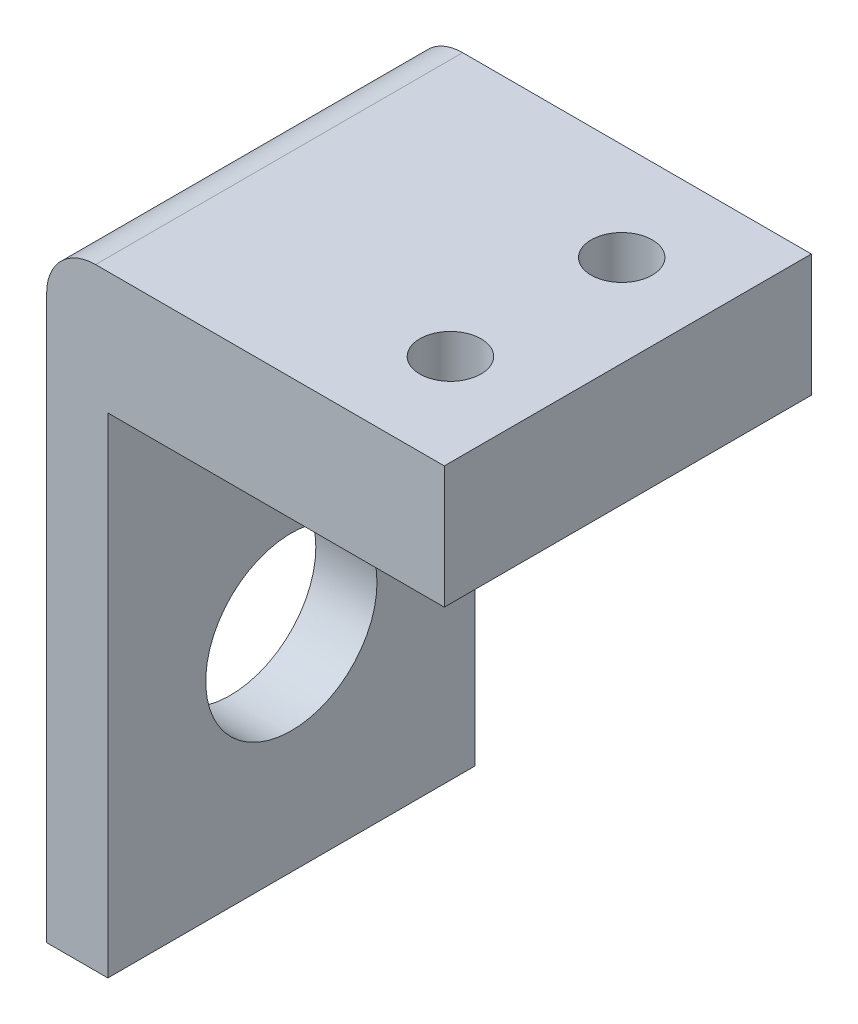
ISO-10303-21;
HEADER;
FILE_DESCRIPTION(('STEP AP214'),'2;1');
FILE_NAME('part.step','',(''),(''),'','','');
FILE_SCHEMA(('AUTOMOTIVE_DESIGN { 1 0 10303 214 1 1 1 1 }'));
ENDSEC;
DATA;
#1=APPLICATION_CONTEXT('core data for automotive mechanical design processes');
#2=APPLICATION_PROTOCOL_DEFINITION('international standard','automotive_design',2000,#1);
#3=PRODUCT_CONTEXT('',#1,'mechanical');
#4=PRODUCT('Part','Part','',(#3));
#5=PRODUCT_RELATED_PRODUCT_CATEGORY('part','',(#4));
#6=PRODUCT_DEFINITION_FORMATION('','',#4);
#7=PRODUCT_DEFINITION_CONTEXT('part definition',#1,'design');
#8=PRODUCT_DEFINITION('design','',#6,#7);
#9=PRODUCT_DEFINITION_SHAPE('','',#8);
#10=(LENGTH_UNIT() NAMED_UNIT(*) SI_UNIT(.MILLI.,.METRE.));
#11=(NAMED_UNIT(*) PLANE_ANGLE_UNIT() SI_UNIT($,.RADIAN.));
#12=(NAMED_UNIT(*) SI_UNIT($,.STERADIAN.) SOLID_ANGLE_UNIT());
#13=UNCERTAINTY_MEASURE_WITH_UNIT(LENGTH_MEASURE(1.E-05),#10,'distance_accuracy_value','');
#14=(GEOMETRIC_REPRESENTATION_CONTEXT(3) GLOBAL_UNCERTAINTY_ASSIGNED_CONTEXT((#13)) GLOBAL_UNIT_ASSIGNED_CONTEXT((#10,
#11,#12)) REPRESENTATION_CONTEXT('',''));
#15=CARTESIAN_POINT('',(0.,0.,0.));
#16=DIRECTION('',(0.,0.,1.));
#17=DIRECTION('',(1.,0.,0.));
#18=AXIS2_PLACEMENT_3D('',#15,#16,#17);
#19=CARTESIAN_POINT('',(2.5,0.,-15.));
#20=DIRECTION('',(0.,0.,1.));
#21=DIRECTION('',(1.,0.,0.));
#22=AXIS2_PLACEMENT_3D('',#19,#20,#21);
#23=PLANE('',#22);
#24=DIRECTION('',(0.,1.,0.));
#25=VECTOR('',#24,1.);
#26=CARTESIAN_POINT('',(-2.5,0.,-15.));
#27=LINE('',#26,#25);
#28=CARTESIAN_POINT('',(-2.5,-17.,-15.));
#29=VERTEX_POINT('',#28);
#30=CARTESIAN_POINT('',(-2.5,29.,-15.));
#31=VERTEX_POINT('',#30);
#32=EDGE_CURVE('E166',#29,#31,#27,.T.);
#33=ORIENTED_EDGE('',*,*,#32,.T.);
#34=CARTESIAN_POINT('',(1.5,29.,-15.));
#35=DIRECTION('',(0.,0.,1.));
#36=DIRECTION('',(1.,0.,0.));
#37=AXIS2_PLACEMENT_3D('',#34,#35,#36);
#38=CIRCLE('',#37,4.);
#39=CARTESIAN_POINT('',(1.5,33.,-15.));
#40=VERTEX_POINT('',#39);
#41=EDGE_CURVE('E11',#31,#40,#38,.F.);
#42=ORIENTED_EDGE('',*,*,#41,.T.);
#43=DIRECTION('',(1.,0.,0.));
#44=VECTOR('',#43,1.);
#45=CARTESIAN_POINT('',(-2.5,33.,-15.));
#46=LINE('',#45,#44);
#47=CARTESIAN_POINT('',(30.,33.,-15.));
#48=VERTEX_POINT('',#47);
#49=EDGE_CURVE('E109',#40,#48,#46,.T.);
#50=ORIENTED_EDGE('',*,*,#49,.T.);
#51=DIRECTION('',(0.,1.,0.));
#52=VECTOR('',#51,1.);
#53=CARTESIAN_POINT('',(30.,0.,-15.));
#54=LINE('',#53,#52);
#55=CARTESIAN_POINT('',(30.,23.,-15.));
#56=VERTEX_POINT('',#55);
#57=EDGE_CURVE('E113',#56,#48,#54,.T.);
#58=ORIENTED_EDGE('',*,*,#57,.F.);
#59=DIRECTION('',(1.,0.,0.));
#60=VECTOR('',#59,1.);
#61=CARTESIAN_POINT('',(-2.5,23.,-15.));
#62=LINE('',#61,#60);
#63=CARTESIAN_POINT('',(2.5,23.,-15.));
#64=VERTEX_POINT('',#63);
#65=EDGE_CURVE('E98',#64,#56,#62,.T.);
#66=ORIENTED_EDGE('',*,*,#65,.F.);
#67=DIRECTION('',(0.,1.,0.));
#68=VECTOR('',#67,1.);
#69=CARTESIAN_POINT('',(2.5,0.,-15.));
#70=LINE('',#69,#68);
#71=CARTESIAN_POINT('',(2.5,-17.,-15.));
#72=VERTEX_POINT('',#71);
#73=EDGE_CURVE('E150',#72,#64,#70,.T.);
#74=ORIENTED_EDGE('',*,*,#73,.F.);
#75=DIRECTION('',(-1.,0.,0.));
#76=VECTOR('',#75,1.);
#77=CARTESIAN_POINT('',(2.5,-17.,-15.));
#78=LINE('',#77,#76);
#79=EDGE_CURVE('E162',#72,#29,#78,.T.);
#80=ORIENTED_EDGE('',*,*,#79,.T.);
#81=EDGE_LOOP('',(#33,#42,#50,#58,#66,#74,#80));
#82=FACE_BOUND('',#81,.T.);
#83=ADVANCED_FACE('F39',(#82),#23,.F.);
#84=CARTESIAN_POINT('',(2.5,0.,15.));
#85=DIRECTION('',(0.,0.,-1.));
#86=DIRECTION('',(0.,1.,0.));
#87=AXIS2_PLACEMENT_3D('',#84,#85,#86);
#88=PLANE('',#87);
#89=DIRECTION('',(1.,0.,0.));
#90=VECTOR('',#89,1.);
#91=CARTESIAN_POINT('',(-2.5,33.,15.));
#92=LINE('',#91,#90);
#93=CARTESIAN_POINT('',(1.5,33.,15.));
#94=VERTEX_POINT('',#93);
#95=CARTESIAN_POINT('',(30.,33.,15.));
#96=VERTEX_POINT('',#95);
#97=EDGE_CURVE('E141',#94,#96,#92,.T.);
#98=ORIENTED_EDGE('',*,*,#97,.F.);
#99=CARTESIAN_POINT('',(1.5,29.,15.));
#100=DIRECTION('',(0.,0.,-1.));
#101=DIRECTION('',(0.,1.,0.));
#102=AXIS2_PLACEMENT_3D('',#99,#100,#101);
#103=CIRCLE('',#102,4.);
#104=CARTESIAN_POINT('',(-2.5,29.,15.));
#105=VERTEX_POINT('',#104);
#106=EDGE_CURVE('E62',#94,#105,#103,.F.);
#107=ORIENTED_EDGE('',*,*,#106,.T.);
#108=DIRECTION('',(0.,-1.,0.));
#109=VECTOR('',#108,1.);
#110=CARTESIAN_POINT('',(-2.5,0.,15.));
#111=LINE('',#110,#109);
#112=CARTESIAN_POINT('',(-2.5,-17.,15.));
#113=VERTEX_POINT('',#112);
#114=EDGE_CURVE('E169',#105,#113,#111,.T.);
#115=ORIENTED_EDGE('',*,*,#114,.T.);
#116=DIRECTION('',(-1.,0.,0.));
#117=VECTOR('',#116,1.);
#118=CARTESIAN_POINT('',(2.5,-17.,15.));
#119=LINE('',#118,#117);
#120=CARTESIAN_POINT('',(2.5,-17.,15.));
#121=VERTEX_POINT('',#120);
#122=EDGE_CURVE('E177',#121,#113,#119,.T.);
#123=ORIENTED_EDGE('',*,*,#122,.F.);
#124=DIRECTION('',(0.,-1.,0.));
#125=VECTOR('',#124,1.);
#126=CARTESIAN_POINT('',(2.5,0.,15.));
#127=LINE('',#126,#125);
#128=CARTESIAN_POINT('',(2.5,23.,15.));
#129=VERTEX_POINT('',#128);
#130=EDGE_CURVE('E156',#129,#121,#127,.T.);
#131=ORIENTED_EDGE('',*,*,#130,.F.);
#132=DIRECTION('',(1.,0.,0.));
#133=VECTOR('',#132,1.);
#134=CARTESIAN_POINT('',(-2.5,23.,15.));
#135=LINE('',#134,#133);
#136=CARTESIAN_POINT('',(30.,23.,15.));
#137=VERTEX_POINT('',#136);
#138=EDGE_CURVE('E137',#129,#137,#135,.T.);
#139=ORIENTED_EDGE('',*,*,#138,.T.);
#140=DIRECTION('',(0.,-1.,0.));
#141=VECTOR('',#140,1.);
#142=CARTESIAN_POINT('',(30.,0.,15.));
#143=LINE('',#142,#141);
#144=EDGE_CURVE('E110',#96,#137,#143,.T.);
#145=ORIENTED_EDGE('',*,*,#144,.F.);
#146=EDGE_LOOP('',(#98,#107,#115,#123,#131,#139,#145));
#147=FACE_BOUND('',#146,.T.);
#148=ADVANCED_FACE('F192',(#147),#88,.F.);
#149=CARTESIAN_POINT('',(2.5,0.,0.));
#150=DIRECTION('',(-1.,0.,0.));
#151=DIRECTION('',(0.,0.,1.));
#152=AXIS2_PLACEMENT_3D('',#149,#150,#151);
#153=CYLINDRICAL_SURFACE('',#152,7.);
#154=CARTESIAN_POINT('',(2.5,0.,0.));
#155=DIRECTION('',(1.,0.,0.));
#156=DIRECTION('',(0.,0.,-1.));
#157=AXIS2_PLACEMENT_3D('',#154,#155,#156);
#158=CIRCLE('',#157,7.);
#159=CARTESIAN_POINT('',(2.5,0.,-7.));
#160=VERTEX_POINT('',#159);
#161=EDGE_CURVE('E146',#160,#160,#158,.T.);
#162=ORIENTED_EDGE('',*,*,#161,.T.);
#163=EDGE_LOOP('',(#162));
#164=FACE_BOUND('',#163,.T.);
#165=CARTESIAN_POINT('',(-2.5,0.,0.));
#166=DIRECTION('',(1.,0.,0.));
#167=DIRECTION('',(0.,0.,-1.));
#168=AXIS2_PLACEMENT_3D('',#165,#166,#167);
#169=CIRCLE('',#168,7.);
#170=CARTESIAN_POINT('',(-2.5,0.,-7.));
#171=VERTEX_POINT('',#170);
#172=EDGE_CURVE('E140',#171,#171,#169,.T.);
#173=ORIENTED_EDGE('',*,*,#172,.F.);
#174=EDGE_LOOP('',(#173));
#175=FACE_BOUND('',#174,.T.);
#176=ADVANCED_FACE('F204',(#164,#175),#153,.F.);
#177=CARTESIAN_POINT('',(2.5,-17.,0.));
#178=DIRECTION('',(0.,1.,0.));
#179=DIRECTION('',(0.,0.,1.));
#180=AXIS2_PLACEMENT_3D('',#177,#178,#179);
#181=PLANE('',#180);
#182=DIRECTION('',(0.,0.,-1.));
#183=VECTOR('',#182,1.);
#184=CARTESIAN_POINT('',(-2.5,-17.,0.));
#185=LINE('',#184,#183);
#186=EDGE_CURVE('E151',#113,#29,#185,.T.);
#187=ORIENTED_EDGE('',*,*,#186,.T.);
#188=ORIENTED_EDGE('',*,*,#79,.F.);
#189=DIRECTION('',(0.,0.,-1.));
#190=VECTOR('',#189,1.);
#191=CARTESIAN_POINT('',(2.5,-17.,0.));
#192=LINE('',#191,#190);
#193=EDGE_CURVE('E159',#121,#72,#192,.T.);
#194=ORIENTED_EDGE('',*,*,#193,.F.);
#195=ORIENTED_EDGE('',*,*,#122,.T.);
#196=EDGE_LOOP('',(#187,#188,#194,#195));
#197=FACE_BOUND('',#196,.T.);
#198=ADVANCED_FACE('F202',(#197),#181,.F.);
#199=CARTESIAN_POINT('',(2.5,0.,0.));
#200=DIRECTION('',(1.,0.,0.));
#201=DIRECTION('',(0.,0.,-1.));
#202=AXIS2_PLACEMENT_3D('',#199,#200,#201);
#203=PLANE('',#202);
#204=ORIENTED_EDGE('',*,*,#161,.F.);
#205=EDGE_LOOP('',(#204));
#206=FACE_BOUND('',#205,.T.);
#207=ORIENTED_EDGE('',*,*,#73,.T.);
#208=DIRECTION('',(0.,0.,1.));
#209=VECTOR('',#208,1.);
#210=CARTESIAN_POINT('',(2.5,23.,0.));
#211=LINE('',#210,#209);
#212=EDGE_CURVE('E104',#64,#129,#211,.T.);
#213=ORIENTED_EDGE('',*,*,#212,.T.);
#214=ORIENTED_EDGE('',*,*,#130,.T.);
#215=ORIENTED_EDGE('',*,*,#193,.T.);
#216=EDGE_LOOP('',(#207,#213,#214,#215));
#217=FACE_BOUND('',#216,.T.);
#218=ADVANCED_FACE('F196',(#206,#217),#203,.T.);
#219=CARTESIAN_POINT('',(-2.5,0.,0.));
#220=DIRECTION('',(1.,0.,0.));
#221=DIRECTION('',(0.,0.,-1.));
#222=AXIS2_PLACEMENT_3D('',#219,#220,#221);
#223=PLANE('',#222);
#224=ORIENTED_EDGE('',*,*,#172,.T.);
#225=EDGE_LOOP('',(#224));
#226=FACE_BOUND('',#225,.T.);
#227=ORIENTED_EDGE('',*,*,#114,.F.);
#228=DIRECTION('',(0.,0.,1.));
#229=VECTOR('',#228,1.);
#230=CARTESIAN_POINT('',(-2.5,29.,-15.));
#231=LINE('',#230,#229);
#232=EDGE_CURVE('E48',#105,#31,#231,.F.);
#233=ORIENTED_EDGE('',*,*,#232,.T.);
#234=ORIENTED_EDGE('',*,*,#32,.F.);
#235=ORIENTED_EDGE('',*,*,#186,.F.);
#236=EDGE_LOOP('',(#227,#233,#234,#235));
#237=FACE_BOUND('',#236,.T.);
#238=ADVANCED_FACE('F201',(#226,#237),#223,.F.);
#239=CARTESIAN_POINT('',(-2.5,23.,0.));
#240=DIRECTION('',(0.,1.,0.));
#241=DIRECTION('',(0.,0.,1.));
#242=AXIS2_PLACEMENT_3D('',#239,#240,#241);
#243=PLANE('',#242);
#244=CARTESIAN_POINT('',(22.5,23.,7.));
#245=DIRECTION('',(0.,1.,0.));
#246=DIRECTION('',(0.,0.,1.));
#247=AXIS2_PLACEMENT_3D('',#244,#245,#246);
#248=CIRCLE('',#247,2.5);
#249=CARTESIAN_POINT('',(22.5,23.,9.5));
#250=VERTEX_POINT('',#249);
#251=EDGE_CURVE('E125',#250,#250,#248,.T.);
#252=ORIENTED_EDGE('',*,*,#251,.T.);
#253=EDGE_LOOP('',(#252));
#254=FACE_BOUND('',#253,.T.);
#255=CARTESIAN_POINT('',(22.5,23.,-7.));
#256=DIRECTION('',(0.,1.,0.));
#257=DIRECTION('',(0.,0.,1.));
#258=AXIS2_PLACEMENT_3D('',#255,#256,#257);
#259=CIRCLE('',#258,2.5);
#260=CARTESIAN_POINT('',(22.5,23.,-4.5));
#261=VERTEX_POINT('',#260);
#262=EDGE_CURVE('E129',#261,#261,#259,.T.);
#263=ORIENTED_EDGE('',*,*,#262,.T.);
#264=EDGE_LOOP('',(#263));
#265=FACE_BOUND('',#264,.T.);
#266=ORIENTED_EDGE('',*,*,#212,.F.);
#267=ORIENTED_EDGE('',*,*,#65,.T.);
#268=DIRECTION('',(0.,0.,1.));
#269=VECTOR('',#268,1.);
#270=CARTESIAN_POINT('',(30.,23.,0.));
#271=LINE('',#270,#269);
#272=EDGE_CURVE('E102',#56,#137,#271,.T.);
#273=ORIENTED_EDGE('',*,*,#272,.T.);
#274=ORIENTED_EDGE('',*,*,#138,.F.);
#275=EDGE_LOOP('',(#266,#267,#273,#274));
#276=FACE_BOUND('',#275,.T.);
#277=ADVANCED_FACE('F100',(#254,#265,#276),#243,.F.);
#278=CARTESIAN_POINT('',(-2.5,33.,0.));
#279=DIRECTION('',(0.,1.,0.));
#280=DIRECTION('',(0.,0.,1.));
#281=AXIS2_PLACEMENT_3D('',#278,#279,#280);
#282=PLANE('',#281);
#283=CARTESIAN_POINT('',(22.5,33.,7.));
#284=DIRECTION('',(0.,1.,0.));
#285=DIRECTION('',(0.,0.,1.));
#286=AXIS2_PLACEMENT_3D('',#283,#284,#285);
#287=CIRCLE('',#286,2.5);
#288=CARTESIAN_POINT('',(22.5,33.,9.5));
#289=VERTEX_POINT('',#288);
#290=EDGE_CURVE('E334',#289,#289,#287,.T.);
#291=ORIENTED_EDGE('',*,*,#290,.F.);
#292=EDGE_LOOP('',(#291));
#293=FACE_BOUND('',#292,.T.);
#294=CARTESIAN_POINT('',(22.5,33.,-7.));
#295=DIRECTION('',(0.,1.,0.));
#296=DIRECTION('',(0.,0.,1.));
#297=AXIS2_PLACEMENT_3D('',#294,#295,#296);
#298=CIRCLE('',#297,2.5);
#299=CARTESIAN_POINT('',(22.5,33.,-4.5));
#300=VERTEX_POINT('',#299);
#301=EDGE_CURVE('E337',#300,#300,#298,.T.);
#302=ORIENTED_EDGE('',*,*,#301,.F.);
#303=EDGE_LOOP('',(#302));
#304=FACE_BOUND('',#303,.T.);
#305=ORIENTED_EDGE('',*,*,#49,.F.);
#306=DIRECTION('',(0.,0.,1.));
#307=VECTOR('',#306,1.);
#308=CARTESIAN_POINT('',(1.5,33.,15.));
#309=LINE('',#308,#307);
#310=EDGE_CURVE('E181',#40,#94,#309,.T.);
#311=ORIENTED_EDGE('',*,*,#310,.T.);
#312=ORIENTED_EDGE('',*,*,#97,.T.);
#313=DIRECTION('',(0.,0.,1.));
#314=VECTOR('',#313,1.);
#315=CARTESIAN_POINT('',(30.,33.,0.));
#316=LINE('',#315,#314);
#317=EDGE_CURVE('E119',#48,#96,#316,.T.);
#318=ORIENTED_EDGE('',*,*,#317,.F.);
#319=EDGE_LOOP('',(#305,#311,#312,#318));
#320=FACE_BOUND('',#319,.T.);
#321=ADVANCED_FACE('F189',(#293,#304,#320),#282,.T.);
#322=CARTESIAN_POINT('',(30.,0.,0.));
#323=DIRECTION('',(1.,0.,0.));
#324=DIRECTION('',(0.,0.,-1.));
#325=AXIS2_PLACEMENT_3D('',#322,#323,#324);
#326=PLANE('',#325);
#327=ORIENTED_EDGE('',*,*,#272,.F.);
#328=ORIENTED_EDGE('',*,*,#57,.T.);
#329=ORIENTED_EDGE('',*,*,#317,.T.);
#330=ORIENTED_EDGE('',*,*,#144,.T.);
#331=EDGE_LOOP('',(#327,#328,#329,#330));
#332=FACE_BOUND('',#331,.T.);
#333=ADVANCED_FACE('F122',(#332),#326,.T.);
#334=CARTESIAN_POINT('',(22.5,20.,-7.));
#335=DIRECTION('',(0.,1.,0.));
#336=DIRECTION('',(0.,0.,1.));
#337=AXIS2_PLACEMENT_3D('',#334,#335,#336);
#338=CYLINDRICAL_SURFACE('',#337,2.5);
#339=ORIENTED_EDGE('',*,*,#301,.T.);
#340=EDGE_LOOP('',(#339));
#341=FACE_BOUND('',#340,.T.);
#342=ORIENTED_EDGE('',*,*,#262,.F.);
#343=EDGE_LOOP('',(#342));
#344=FACE_BOUND('',#343,.T.);
#345=ADVANCED_FACE('F251',(#341,#344),#338,.F.);
#346=CARTESIAN_POINT('',(22.5,20.,7.));
#347=DIRECTION('',(0.,1.,0.));
#348=DIRECTION('',(0.,0.,1.));
#349=AXIS2_PLACEMENT_3D('',#346,#347,#348);
#350=CYLINDRICAL_SURFACE('',#349,2.5);
#351=ORIENTED_EDGE('',*,*,#290,.T.);
#352=EDGE_LOOP('',(#351));
#353=FACE_BOUND('',#352,.T.);
#354=ORIENTED_EDGE('',*,*,#251,.F.);
#355=EDGE_LOOP('',(#354));
#356=FACE_BOUND('',#355,.T.);
#357=ADVANCED_FACE('F273',(#353,#356),#350,.F.);
#358=CARTESIAN_POINT('',(1.5,29.,0.));
#359=DIRECTION('',(0.,0.,-1.));
#360=DIRECTION('',(-1.,0.,0.));
#361=AXIS2_PLACEMENT_3D('',#358,#359,#360);
#362=CYLINDRICAL_SURFACE('',#361,4.);
#363=ORIENTED_EDGE('',*,*,#41,.F.);
#364=ORIENTED_EDGE('',*,*,#232,.F.);
#365=ORIENTED_EDGE('',*,*,#106,.F.);
#366=ORIENTED_EDGE('',*,*,#310,.F.);
#367=EDGE_LOOP('',(#363,#364,#365,#366));
#368=FACE_BOUND('',#367,.T.);
#369=ADVANCED_FACE('F41',(#368),#362,.T.);
#370=CLOSED_SHELL('',(#83,#148,#176,#198,#218,#238,#277,#321,#333,#345,#357,#369));
#371=MANIFOLD_SOLID_BREP('B2',#370);
#372=ADVANCED_BREP_SHAPE_REPRESENTATION('',(#18,#371),#14);
#373=SHAPE_DEFINITION_REPRESENTATION(#9,#372);
ENDSEC;
END-ISO-10303-21;
